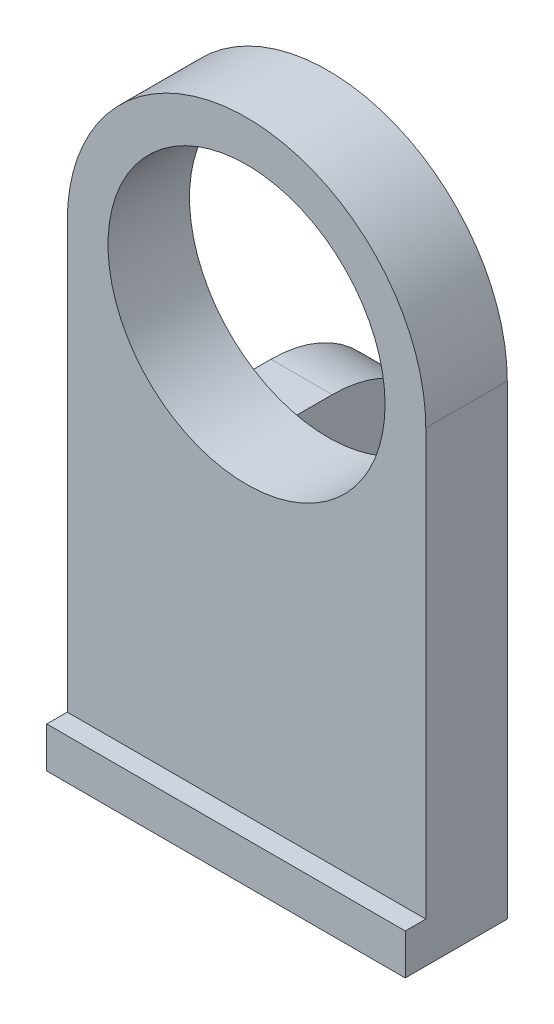
ISO-10303-21;
HEADER;
FILE_DESCRIPTION(('STEP AP214'),'2;1');
FILE_NAME('part.step','',(''),(''),'','','');
FILE_SCHEMA(('AUTOMOTIVE_DESIGN { 1 0 10303 214 1 1 1 1 }'));
ENDSEC;
DATA;
#1=APPLICATION_CONTEXT('core data for automotive mechanical design processes');
#2=APPLICATION_PROTOCOL_DEFINITION('international standard','automotive_design',2000,#1);
#3=PRODUCT_CONTEXT('',#1,'mechanical');
#4=PRODUCT('Part','Part','',(#3));
#5=PRODUCT_RELATED_PRODUCT_CATEGORY('part','',(#4));
#6=PRODUCT_DEFINITION_FORMATION('','',#4);
#7=PRODUCT_DEFINITION_CONTEXT('part definition',#1,'design');
#8=PRODUCT_DEFINITION('design','',#6,#7);
#9=PRODUCT_DEFINITION_SHAPE('','',#8);
#10=(LENGTH_UNIT() NAMED_UNIT(*) SI_UNIT(.MILLI.,.METRE.));
#11=(NAMED_UNIT(*) PLANE_ANGLE_UNIT() SI_UNIT($,.RADIAN.));
#12=(NAMED_UNIT(*) SI_UNIT($,.STERADIAN.) SOLID_ANGLE_UNIT());
#13=UNCERTAINTY_MEASURE_WITH_UNIT(LENGTH_MEASURE(1.E-05),#10,'distance_accuracy_value','');
#14=(GEOMETRIC_REPRESENTATION_CONTEXT(3) GLOBAL_UNCERTAINTY_ASSIGNED_CONTEXT((#13)) GLOBAL_UNIT_ASSIGNED_CONTEXT((#10,
#11,#12)) REPRESENTATION_CONTEXT('',''));
#15=CARTESIAN_POINT('',(0.,0.,0.));
#16=DIRECTION('',(0.,0.,1.));
#17=DIRECTION('',(1.,0.,0.));
#18=AXIS2_PLACEMENT_3D('',#15,#16,#17);
#19=CARTESIAN_POINT('',(0.,0.,-9.5504));
#20=DIRECTION('',(0.,0.,-1.));
#21=DIRECTION('',(1.,0.,0.));
#22=AXIS2_PLACEMENT_3D('',#19,#20,#21);
#23=PLANE('',#22);
#24=DIRECTION('',(0.,-1.,0.));
#25=VECTOR('',#24,1.);
#26=CARTESIAN_POINT('',(-13.97,0.,-9.5504));
#27=LINE('',#26,#25);
#28=CARTESIAN_POINT('',(-13.97,0.,-9.5504));
#29=VERTEX_POINT('',#28);
#30=CARTESIAN_POINT('',(-13.97,-14.097,-9.5504));
#31=VERTEX_POINT('',#30);
#32=EDGE_CURVE('E169',#29,#31,#27,.T.);
#33=ORIENTED_EDGE('',*,*,#32,.F.);
#34=CARTESIAN_POINT('',(0.,0.,-9.5504));
#35=DIRECTION('',(0.,0.,1.));
#36=DIRECTION('',(1.,0.,0.));
#37=AXIS2_PLACEMENT_3D('',#34,#35,#36);
#38=CIRCLE('',#37,13.97);
#39=CARTESIAN_POINT('',(13.97,0.,-9.5504));
#40=VERTEX_POINT('',#39);
#41=EDGE_CURVE('E166',#40,#29,#38,.T.);
#42=ORIENTED_EDGE('',*,*,#41,.F.);
#43=DIRECTION('',(0.,1.,0.));
#44=VECTOR('',#43,1.);
#45=CARTESIAN_POINT('',(13.97,0.,-9.5504));
#46=LINE('',#45,#44);
#47=CARTESIAN_POINT('',(13.97,-36.322,-9.5504));
#48=VERTEX_POINT('',#47);
#49=EDGE_CURVE('E173',#48,#40,#46,.T.);
#50=ORIENTED_EDGE('',*,*,#49,.F.);
#51=DIRECTION('',(1.,0.,0.));
#52=VECTOR('',#51,1.);
#53=CARTESIAN_POINT('',(-13.97,-36.322,-9.5504));
#54=LINE('',#53,#52);
#55=CARTESIAN_POINT('',(-9.1948,-36.322,-9.5504));
#56=VERTEX_POINT('',#55);
#57=EDGE_CURVE('E133',#56,#48,#54,.T.);
#58=ORIENTED_EDGE('',*,*,#57,.F.);
#59=DIRECTION('',(0.,-1.,0.));
#60=VECTOR('',#59,1.);
#61=CARTESIAN_POINT('',(-9.1948,-17.272,-9.5504));
#62=LINE('',#61,#60);
#63=CARTESIAN_POINT('',(-9.1948,-14.097,-9.5504));
#64=VERTEX_POINT('',#63);
#65=EDGE_CURVE('E117',#64,#56,#62,.T.);
#66=ORIENTED_EDGE('',*,*,#65,.F.);
#67=DIRECTION('',(-1.,0.,0.));
#68=VECTOR('',#67,1.);
#69=CARTESIAN_POINT('',(-9.1948,-14.097,-9.5504));
#70=LINE('',#69,#68);
#71=EDGE_CURVE('E191',#31,#64,#70,.F.);
#72=ORIENTED_EDGE('',*,*,#71,.F.);
#73=EDGE_LOOP('',(#33,#42,#50,#58,#66,#72));
#74=FACE_BOUND('',#73,.T.);
#75=CARTESIAN_POINT('',(0.,0.,-9.5504));
#76=DIRECTION('',(0.,0.,1.));
#77=DIRECTION('',(1.,0.,0.));
#78=AXIS2_PLACEMENT_3D('',#75,#76,#77);
#79=CIRCLE('',#78,10.795);
#80=CARTESIAN_POINT('',(10.795,0.,-9.5504));
#81=VERTEX_POINT('',#80);
#82=EDGE_CURVE('E160',#81,#81,#79,.T.);
#83=ORIENTED_EDGE('',*,*,#82,.T.);
#84=EDGE_LOOP('',(#83));
#85=FACE_BOUND('',#84,.T.);
#86=ADVANCED_FACE('F35',(#74,#85),#23,.T.);
#87=CARTESIAN_POINT('',(0.,0.,-3.2004));
#88=DIRECTION('',(0.,0.,-1.));
#89=DIRECTION('',(1.,0.,0.));
#90=AXIS2_PLACEMENT_3D('',#87,#88,#89);
#91=PLANE('',#90);
#92=CARTESIAN_POINT('',(0.,0.,-3.2004));
#93=DIRECTION('',(0.,0.,1.));
#94=DIRECTION('',(1.,0.,0.));
#95=AXIS2_PLACEMENT_3D('',#92,#93,#94);
#96=CIRCLE('',#95,13.97);
#97=CARTESIAN_POINT('',(13.97,0.,-3.2004));
#98=VERTEX_POINT('',#97);
#99=CARTESIAN_POINT('',(-13.97,0.,-3.2004));
#100=VERTEX_POINT('',#99);
#101=EDGE_CURVE('E163',#98,#100,#96,.T.);
#102=ORIENTED_EDGE('',*,*,#101,.T.);
#103=DIRECTION('',(0.,-1.,0.));
#104=VECTOR('',#103,1.);
#105=CARTESIAN_POINT('',(-13.97,0.,-3.2004));
#106=LINE('',#105,#104);
#107=CARTESIAN_POINT('',(-13.97,-33.147,-3.2004));
#108=VERTEX_POINT('',#107);
#109=EDGE_CURVE('E179',#100,#108,#106,.T.);
#110=ORIENTED_EDGE('',*,*,#109,.T.);
#111=DIRECTION('',(1.,0.,0.));
#112=VECTOR('',#111,1.);
#113=CARTESIAN_POINT('',(-13.97,-33.147,-3.2004));
#114=LINE('',#113,#112);
#115=CARTESIAN_POINT('',(13.97,-33.147,-3.2004));
#116=VERTEX_POINT('',#115);
#117=EDGE_CURVE('E182',#108,#116,#114,.T.);
#118=ORIENTED_EDGE('',*,*,#117,.T.);
#119=DIRECTION('',(0.,1.,0.));
#120=VECTOR('',#119,1.);
#121=CARTESIAN_POINT('',(13.97,0.,-3.2004));
#122=LINE('',#121,#120);
#123=EDGE_CURVE('E170',#116,#98,#122,.T.);
#124=ORIENTED_EDGE('',*,*,#123,.T.);
#125=EDGE_LOOP('',(#102,#110,#118,#124));
#126=FACE_BOUND('',#125,.T.);
#127=CARTESIAN_POINT('',(0.,0.,-3.2004));
#128=DIRECTION('',(0.,0.,1.));
#129=DIRECTION('',(1.,0.,0.));
#130=AXIS2_PLACEMENT_3D('',#127,#128,#129);
#131=CIRCLE('',#130,10.795);
#132=CARTESIAN_POINT('',(10.795,0.,-3.2004));
#133=VERTEX_POINT('',#132);
#134=EDGE_CURVE('E153',#133,#133,#131,.T.);
#135=ORIENTED_EDGE('',*,*,#134,.F.);
#136=EDGE_LOOP('',(#135));
#137=FACE_BOUND('',#136,.T.);
#138=ADVANCED_FACE('F226',(#126,#137),#91,.F.);
#139=CARTESIAN_POINT('',(0.,0.,-9.5504));
#140=DIRECTION('',(0.,0.,1.));
#141=DIRECTION('',(-1.,0.,0.));
#142=AXIS2_PLACEMENT_3D('',#139,#140,#141);
#143=CYLINDRICAL_SURFACE('',#142,13.97);
#144=ORIENTED_EDGE('',*,*,#101,.F.);
#145=DIRECTION('',(0.,0.,1.));
#146=VECTOR('',#145,1.);
#147=CARTESIAN_POINT('',(13.97,0.,-9.5504));
#148=LINE('',#147,#146);
#149=EDGE_CURVE('E176',#40,#98,#148,.T.);
#150=ORIENTED_EDGE('',*,*,#149,.F.);
#151=ORIENTED_EDGE('',*,*,#41,.T.);
#152=DIRECTION('',(0.,0.,1.));
#153=VECTOR('',#152,1.);
#154=CARTESIAN_POINT('',(-13.97,0.,-9.5504));
#155=LINE('',#154,#153);
#156=EDGE_CURVE('E188',#29,#100,#155,.T.);
#157=ORIENTED_EDGE('',*,*,#156,.T.);
#158=EDGE_LOOP('',(#144,#150,#151,#157));
#159=FACE_BOUND('',#158,.T.);
#160=ADVANCED_FACE('F208',(#159),#143,.T.);
#161=CARTESIAN_POINT('',(-13.97,0.,-9.5504));
#162=DIRECTION('',(1.,0.,0.));
#163=DIRECTION('',(0.,0.,1.));
#164=AXIS2_PLACEMENT_3D('',#161,#162,#163);
#165=PLANE('',#164);
#166=ORIENTED_EDGE('',*,*,#109,.F.);
#167=ORIENTED_EDGE('',*,*,#156,.F.);
#168=ORIENTED_EDGE('',*,*,#32,.T.);
#169=CARTESIAN_POINT('',(-13.97,-14.097,-12.7254));
#170=DIRECTION('',(-1.,0.,0.));
#171=DIRECTION('',(0.,0.,1.));
#172=AXIS2_PLACEMENT_3D('',#169,#170,#171);
#173=CIRCLE('',#172,3.175);
#174=CARTESIAN_POINT('',(-13.97,-17.272,-12.7254));
#175=VERTEX_POINT('',#174);
#176=EDGE_CURVE('E43',#175,#31,#173,.T.);
#177=ORIENTED_EDGE('',*,*,#176,.F.);
#178=DIRECTION('',(0.,0.,1.));
#179=VECTOR('',#178,1.);
#180=CARTESIAN_POINT('',(-13.97,-17.272,-19.0754));
#181=LINE('',#180,#179);
#182=CARTESIAN_POINT('',(-13.97,-17.272,-19.0754));
#183=VERTEX_POINT('',#182);
#184=EDGE_CURVE('E125',#183,#175,#181,.T.);
#185=ORIENTED_EDGE('',*,*,#184,.F.);
#186=CARTESIAN_POINT('',(-13.97,-26.797,-19.0754));
#187=DIRECTION('',(1.,0.,0.));
#188=DIRECTION('',(0.,0.,-1.));
#189=AXIS2_PLACEMENT_3D('',#186,#187,#188);
#190=CIRCLE('',#189,9.525);
#191=CARTESIAN_POINT('',(-13.97,-36.322,-19.0754));
#192=VERTEX_POINT('',#191);
#193=EDGE_CURVE('E129',#192,#183,#190,.T.);
#194=ORIENTED_EDGE('',*,*,#193,.F.);
#195=DIRECTION('',(0.,0.,-1.));
#196=VECTOR('',#195,1.);
#197=CARTESIAN_POINT('',(-13.97,-36.322,-1.6002));
#198=LINE('',#197,#196);
#199=CARTESIAN_POINT('',(-13.97,-36.322,-1.6002));
#200=VERTEX_POINT('',#199);
#201=EDGE_CURVE('E148',#200,#192,#198,.T.);
#202=ORIENTED_EDGE('',*,*,#201,.F.);
#203=DIRECTION('',(0.,-1.,0.));
#204=VECTOR('',#203,1.);
#205=CARTESIAN_POINT('',(-13.97,-33.147,-1.6002));
#206=LINE('',#205,#204);
#207=CARTESIAN_POINT('',(-13.97,-33.147,-1.6002));
#208=VERTEX_POINT('',#207);
#209=EDGE_CURVE('E138',#208,#200,#206,.T.);
#210=ORIENTED_EDGE('',*,*,#209,.F.);
#211=DIRECTION('',(0.,0.,-1.));
#212=VECTOR('',#211,1.);
#213=CARTESIAN_POINT('',(-13.97,-33.147,-1.6002));
#214=LINE('',#213,#212);
#215=EDGE_CURVE('E151',#208,#108,#214,.T.);
#216=ORIENTED_EDGE('',*,*,#215,.T.);
#217=EDGE_LOOP('',(#166,#167,#168,#177,#185,#194,#202,#210,#216));
#218=FACE_BOUND('',#217,.T.);
#219=CARTESIAN_POINT('',(-13.97,-26.797,-19.0754));
#220=DIRECTION('',(1.,0.,0.));
#221=DIRECTION('',(0.,0.,-1.));
#222=AXIS2_PLACEMENT_3D('',#219,#220,#221);
#223=CIRCLE('',#222,3.556);
#224=CARTESIAN_POINT('',(-13.97,-26.797,-22.6314));
#225=VERTEX_POINT('',#224);
#226=EDGE_CURVE('E341',#225,#225,#223,.T.);
#227=ORIENTED_EDGE('',*,*,#226,.T.);
#228=EDGE_LOOP('',(#227));
#229=FACE_BOUND('',#228,.T.);
#230=ADVANCED_FACE('F203',(#218,#229),#165,.F.);
#231=CARTESIAN_POINT('',(13.97,0.,-9.5504));
#232=DIRECTION('',(-1.,0.,0.));
#233=DIRECTION('',(0.,0.,-1.));
#234=AXIS2_PLACEMENT_3D('',#231,#232,#233);
#235=PLANE('',#234);
#236=ORIENTED_EDGE('',*,*,#123,.F.);
#237=DIRECTION('',(0.,0.,-1.));
#238=VECTOR('',#237,1.);
#239=CARTESIAN_POINT('',(13.97,-33.147,-1.6002));
#240=LINE('',#239,#238);
#241=CARTESIAN_POINT('',(13.97,-33.147,-1.6002));
#242=VERTEX_POINT('',#241);
#243=EDGE_CURVE('E154',#242,#116,#240,.T.);
#244=ORIENTED_EDGE('',*,*,#243,.F.);
#245=DIRECTION('',(0.,1.,0.));
#246=VECTOR('',#245,1.);
#247=CARTESIAN_POINT('',(13.97,-33.147,-1.6002));
#248=LINE('',#247,#246);
#249=CARTESIAN_POINT('',(13.97,-36.322,-1.6002));
#250=VERTEX_POINT('',#249);
#251=EDGE_CURVE('E143',#250,#242,#248,.T.);
#252=ORIENTED_EDGE('',*,*,#251,.F.);
#253=DIRECTION('',(0.,0.,-1.));
#254=VECTOR('',#253,1.);
#255=CARTESIAN_POINT('',(13.97,-36.322,-1.6002));
#256=LINE('',#255,#254);
#257=EDGE_CURVE('E156',#250,#48,#256,.T.);
#258=ORIENTED_EDGE('',*,*,#257,.T.);
#259=ORIENTED_EDGE('',*,*,#49,.T.);
#260=ORIENTED_EDGE('',*,*,#149,.T.);
#261=EDGE_LOOP('',(#236,#244,#252,#258,#259,#260));
#262=FACE_BOUND('',#261,.T.);
#263=ADVANCED_FACE('F211',(#262),#235,.F.);
#264=CARTESIAN_POINT('',(0.,0.,-9.5504));
#265=DIRECTION('',(0.,0.,1.));
#266=DIRECTION('',(-1.,0.,0.));
#267=AXIS2_PLACEMENT_3D('',#264,#265,#266);
#268=CYLINDRICAL_SURFACE('',#267,10.795);
#269=ORIENTED_EDGE('',*,*,#82,.F.);
#270=EDGE_LOOP('',(#269));
#271=FACE_BOUND('',#270,.T.);
#272=ORIENTED_EDGE('',*,*,#134,.T.);
#273=EDGE_LOOP('',(#272));
#274=FACE_BOUND('',#273,.T.);
#275=ADVANCED_FACE('F232',(#271,#274),#268,.F.);
#276=CARTESIAN_POINT('',(-13.97,-33.147,-1.6002));
#277=DIRECTION('',(0.,1.,0.));
#278=DIRECTION('',(0.,0.,-1.));
#279=AXIS2_PLACEMENT_3D('',#276,#277,#278);
#280=PLANE('',#279);
#281=ORIENTED_EDGE('',*,*,#215,.F.);
#282=DIRECTION('',(-1.,0.,0.));
#283=VECTOR('',#282,1.);
#284=CARTESIAN_POINT('',(-13.97,-33.147,-1.6002));
#285=LINE('',#284,#283);
#286=EDGE_CURVE('E146',#242,#208,#285,.T.);
#287=ORIENTED_EDGE('',*,*,#286,.F.);
#288=ORIENTED_EDGE('',*,*,#243,.T.);
#289=ORIENTED_EDGE('',*,*,#117,.F.);
#290=EDGE_LOOP('',(#281,#287,#288,#289));
#291=FACE_BOUND('',#290,.T.);
#292=ADVANCED_FACE('F224',(#291),#280,.T.);
#293=CARTESIAN_POINT('',(-13.97,-36.322,-1.6002));
#294=DIRECTION('',(0.,-1.,0.));
#295=DIRECTION('',(0.,0.,1.));
#296=AXIS2_PLACEMENT_3D('',#293,#294,#295);
#297=PLANE('',#296);
#298=ORIENTED_EDGE('',*,*,#57,.T.);
#299=ORIENTED_EDGE('',*,*,#257,.F.);
#300=DIRECTION('',(1.,0.,0.));
#301=VECTOR('',#300,1.);
#302=CARTESIAN_POINT('',(-13.97,-36.322,-1.6002));
#303=LINE('',#302,#301);
#304=EDGE_CURVE('E141',#200,#250,#303,.T.);
#305=ORIENTED_EDGE('',*,*,#304,.F.);
#306=ORIENTED_EDGE('',*,*,#201,.T.);
#307=DIRECTION('',(-1.,0.,0.));
#308=VECTOR('',#307,1.);
#309=CARTESIAN_POINT('',(-9.1948,-36.322,-19.0754));
#310=LINE('',#309,#308);
#311=CARTESIAN_POINT('',(-9.1948,-36.322,-19.0754));
#312=VERTEX_POINT('',#311);
#313=EDGE_CURVE('E131',#312,#192,#310,.T.);
#314=ORIENTED_EDGE('',*,*,#313,.F.);
#315=DIRECTION('',(0.,0.,-1.));
#316=VECTOR('',#315,1.);
#317=CARTESIAN_POINT('',(-9.1948,-36.322,-9.5504));
#318=LINE('',#317,#316);
#319=EDGE_CURVE('E122',#56,#312,#318,.T.);
#320=ORIENTED_EDGE('',*,*,#319,.F.);
#321=EDGE_LOOP('',(#298,#299,#305,#306,#314,#320));
#322=FACE_BOUND('',#321,.T.);
#323=ADVANCED_FACE('F216',(#322),#297,.T.);
#324=CARTESIAN_POINT('',(0.,0.,-1.6002));
#325=DIRECTION('',(0.,0.,-1.));
#326=DIRECTION('',(1.,0.,0.));
#327=AXIS2_PLACEMENT_3D('',#324,#325,#326);
#328=PLANE('',#327);
#329=ORIENTED_EDGE('',*,*,#209,.T.);
#330=ORIENTED_EDGE('',*,*,#304,.T.);
#331=ORIENTED_EDGE('',*,*,#251,.T.);
#332=ORIENTED_EDGE('',*,*,#286,.T.);
#333=EDGE_LOOP('',(#329,#330,#331,#332));
#334=FACE_BOUND('',#333,.T.);
#335=ADVANCED_FACE('F222',(#334),#328,.F.);
#336=CARTESIAN_POINT('',(-9.1948,-26.797,-19.0754));
#337=DIRECTION('',(-1.,0.,0.));
#338=DIRECTION('',(0.,0.,-1.));
#339=AXIS2_PLACEMENT_3D('',#336,#337,#338);
#340=CYLINDRICAL_SURFACE('',#339,9.525);
#341=ORIENTED_EDGE('',*,*,#193,.T.);
#342=DIRECTION('',(-1.,0.,0.));
#343=VECTOR('',#342,1.);
#344=CARTESIAN_POINT('',(-9.1948,-17.272,-19.0754));
#345=LINE('',#344,#343);
#346=CARTESIAN_POINT('',(-9.1948,-17.272,-19.0754));
#347=VERTEX_POINT('',#346);
#348=EDGE_CURVE('E114',#347,#183,#345,.T.);
#349=ORIENTED_EDGE('',*,*,#348,.F.);
#350=CARTESIAN_POINT('',(-9.1948,-26.797,-19.0754));
#351=DIRECTION('',(1.,0.,0.));
#352=DIRECTION('',(0.,0.,-1.));
#353=AXIS2_PLACEMENT_3D('',#350,#351,#352);
#354=CIRCLE('',#353,9.525);
#355=EDGE_CURVE('E118',#312,#347,#354,.T.);
#356=ORIENTED_EDGE('',*,*,#355,.F.);
#357=ORIENTED_EDGE('',*,*,#313,.T.);
#358=EDGE_LOOP('',(#341,#349,#356,#357));
#359=FACE_BOUND('',#358,.T.);
#360=ADVANCED_FACE('F127',(#359),#340,.T.);
#361=CARTESIAN_POINT('',(-9.1948,-17.272,-19.0754));
#362=DIRECTION('',(0.,1.,0.));
#363=DIRECTION('',(0.,0.,-1.));
#364=AXIS2_PLACEMENT_3D('',#361,#362,#363);
#365=PLANE('',#364);
#366=DIRECTION('',(0.,0.,1.));
#367=VECTOR('',#366,1.);
#368=CARTESIAN_POINT('',(-9.1948,-17.272,-19.0754));
#369=LINE('',#368,#367);
#370=CARTESIAN_POINT('',(-9.1948,-17.272,-12.7254));
#371=VERTEX_POINT('',#370);
#372=EDGE_CURVE('E109',#347,#371,#369,.T.);
#373=ORIENTED_EDGE('',*,*,#372,.F.);
#374=ORIENTED_EDGE('',*,*,#348,.T.);
#375=ORIENTED_EDGE('',*,*,#184,.T.);
#376=DIRECTION('',(-1.,0.,0.));
#377=VECTOR('',#376,1.);
#378=CARTESIAN_POINT('',(-13.97,-17.272,-12.7254));
#379=LINE('',#378,#377);
#380=EDGE_CURVE('E116',#371,#175,#379,.T.);
#381=ORIENTED_EDGE('',*,*,#380,.F.);
#382=EDGE_LOOP('',(#373,#374,#375,#381));
#383=FACE_BOUND('',#382,.T.);
#384=ADVANCED_FACE('F111',(#383),#365,.T.);
#385=CARTESIAN_POINT('',(-9.1948,-26.797,-19.0754));
#386=DIRECTION('',(-1.,0.,0.));
#387=DIRECTION('',(0.,0.,-1.));
#388=AXIS2_PLACEMENT_3D('',#385,#386,#387);
#389=PLANE('',#388);
#390=CARTESIAN_POINT('',(-9.1948,-26.797,-19.0754));
#391=DIRECTION('',(1.,0.,0.));
#392=DIRECTION('',(0.,0.,-1.));
#393=AXIS2_PLACEMENT_3D('',#390,#391,#392);
#394=CIRCLE('',#393,3.556);
#395=CARTESIAN_POINT('',(-9.1948,-26.797,-22.6314));
#396=VERTEX_POINT('',#395);
#397=EDGE_CURVE('E200',#396,#396,#394,.T.);
#398=ORIENTED_EDGE('',*,*,#397,.F.);
#399=EDGE_LOOP('',(#398));
#400=FACE_BOUND('',#399,.T.);
#401=ORIENTED_EDGE('',*,*,#355,.T.);
#402=ORIENTED_EDGE('',*,*,#372,.T.);
#403=CARTESIAN_POINT('',(-9.1948,-14.097,-12.7254));
#404=DIRECTION('',(1.,0.,0.));
#405=DIRECTION('',(0.,0.,-1.));
#406=AXIS2_PLACEMENT_3D('',#403,#404,#405);
#407=CIRCLE('',#406,3.175);
#408=EDGE_CURVE('E11',#64,#371,#407,.T.);
#409=ORIENTED_EDGE('',*,*,#408,.F.);
#410=ORIENTED_EDGE('',*,*,#65,.T.);
#411=ORIENTED_EDGE('',*,*,#319,.T.);
#412=EDGE_LOOP('',(#401,#402,#409,#410,#411));
#413=FACE_BOUND('',#412,.T.);
#414=ADVANCED_FACE('F121',(#400,#413),#389,.F.);
#415=CARTESIAN_POINT('',(-9.1948,-26.797,-19.0754));
#416=DIRECTION('',(-1.,0.,0.));
#417=DIRECTION('',(0.,0.,-1.));
#418=AXIS2_PLACEMENT_3D('',#415,#416,#417);
#419=CYLINDRICAL_SURFACE('',#418,3.556);
#420=ORIENTED_EDGE('',*,*,#397,.T.);
#421=EDGE_LOOP('',(#420));
#422=FACE_BOUND('',#421,.T.);
#423=ORIENTED_EDGE('',*,*,#226,.F.);
#424=EDGE_LOOP('',(#423));
#425=FACE_BOUND('',#424,.T.);
#426=ADVANCED_FACE('F315',(#422,#425),#419,.F.);
#427=CARTESIAN_POINT('',(-9.1948,-14.097,-12.7254));
#428=DIRECTION('',(1.,0.,0.));
#429=DIRECTION('',(0.,0.,1.));
#430=AXIS2_PLACEMENT_3D('',#427,#428,#429);
#431=CYLINDRICAL_SURFACE('',#430,3.175);
#432=ORIENTED_EDGE('',*,*,#408,.T.);
#433=ORIENTED_EDGE('',*,*,#380,.T.);
#434=ORIENTED_EDGE('',*,*,#176,.T.);
#435=ORIENTED_EDGE('',*,*,#71,.T.);
#436=EDGE_LOOP('',(#432,#433,#434,#435));
#437=FACE_BOUND('',#436,.T.);
#438=ADVANCED_FACE('F37',(#437),#431,.F.);
#439=CLOSED_SHELL('',(#86,#138,#160,#230,#263,#275,#292,#323,#335,#360,#384,#414,#426,#438));
#440=MANIFOLD_SOLID_BREP('B2',#439);
#441=ADVANCED_BREP_SHAPE_REPRESENTATION('',(#18,#440),#14);
#442=SHAPE_DEFINITION_REPRESENTATION(#9,#441);
ENDSEC;
END-ISO-10303-21;
